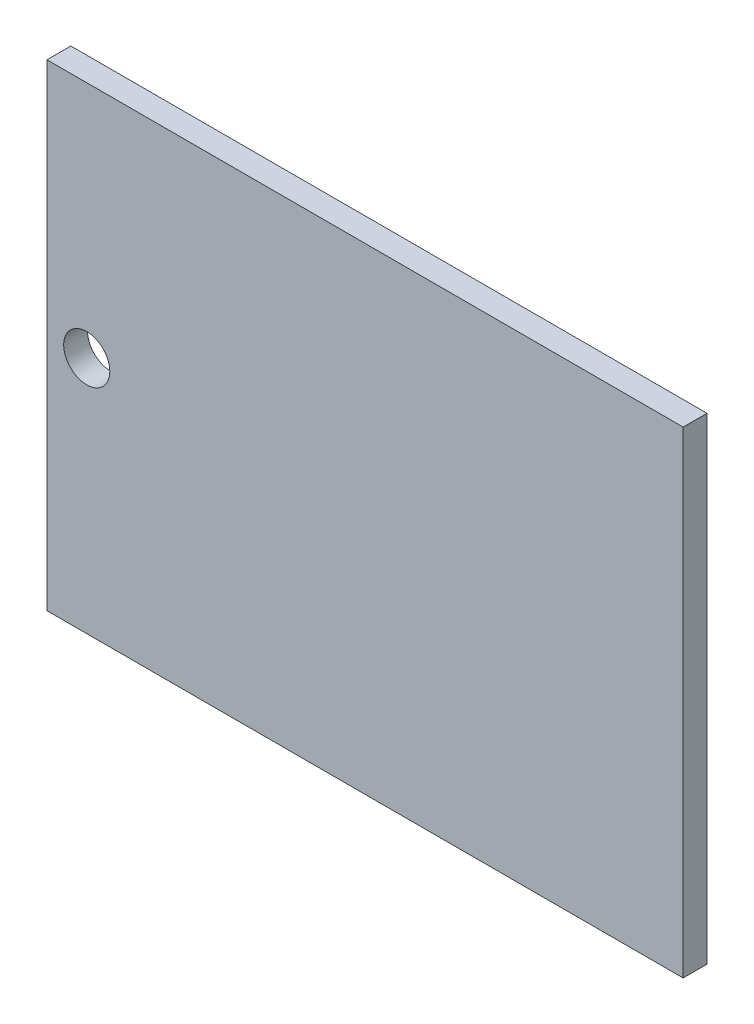
ISO-10303-21;
HEADER;
FILE_DESCRIPTION(('STEP AP214'),'2;1');
FILE_NAME('part.step','',(''),(''),'','','');
FILE_SCHEMA(('AUTOMOTIVE_DESIGN { 1 0 10303 214 1 1 1 1 }'));
ENDSEC;
DATA;
#1=APPLICATION_CONTEXT('core data for automotive mechanical design processes');
#2=APPLICATION_PROTOCOL_DEFINITION('international standard','automotive_design',2000,#1);
#3=PRODUCT_CONTEXT('',#1,'mechanical');
#4=PRODUCT('Part','Part','',(#3));
#5=PRODUCT_RELATED_PRODUCT_CATEGORY('part','',(#4));
#6=PRODUCT_DEFINITION_FORMATION('','',#4);
#7=PRODUCT_DEFINITION_CONTEXT('part definition',#1,'design');
#8=PRODUCT_DEFINITION('design','',#6,#7);
#9=PRODUCT_DEFINITION_SHAPE('','',#8);
#10=(LENGTH_UNIT() NAMED_UNIT(*) SI_UNIT(.MILLI.,.METRE.));
#11=(NAMED_UNIT(*) PLANE_ANGLE_UNIT() SI_UNIT($,.RADIAN.));
#12=(NAMED_UNIT(*) SI_UNIT($,.STERADIAN.) SOLID_ANGLE_UNIT());
#13=UNCERTAINTY_MEASURE_WITH_UNIT(LENGTH_MEASURE(1.E-05),#10,'distance_accuracy_value','');
#14=(GEOMETRIC_REPRESENTATION_CONTEXT(3) GLOBAL_UNCERTAINTY_ASSIGNED_CONTEXT((#13)) GLOBAL_UNIT_ASSIGNED_CONTEXT((#10,
#11,#12)) REPRESENTATION_CONTEXT('',''));
#15=CARTESIAN_POINT('',(0.,0.,0.));
#16=DIRECTION('',(0.,0.,1.));
#17=DIRECTION('',(1.,0.,0.));
#18=AXIS2_PLACEMENT_3D('',#15,#16,#17);
#19=CARTESIAN_POINT('',(20.,-15.,1.5));
#20=DIRECTION('',(-1.,0.,0.));
#21=DIRECTION('',(0.,0.,1.));
#22=AXIS2_PLACEMENT_3D('',#19,#20,#21);
#23=PLANE('',#22);
#24=DIRECTION('',(0.,1.,0.));
#25=VECTOR('',#24,1.);
#26=CARTESIAN_POINT('',(20.,-15.,0.));
#27=LINE('',#26,#25);
#28=CARTESIAN_POINT('',(20.,-15.,0.));
#29=VERTEX_POINT('',#28);
#30=CARTESIAN_POINT('',(20.,15.,0.));
#31=VERTEX_POINT('',#30);
#32=EDGE_CURVE('E105',#29,#31,#27,.T.);
#33=ORIENTED_EDGE('',*,*,#32,.T.);
#34=DIRECTION('',(0.,0.,-1.));
#35=VECTOR('',#34,1.);
#36=CARTESIAN_POINT('',(20.,15.,1.5));
#37=LINE('',#36,#35);
#38=CARTESIAN_POINT('',(20.,15.,1.5));
#39=VERTEX_POINT('',#38);
#40=EDGE_CURVE('E11',#39,#31,#37,.T.);
#41=ORIENTED_EDGE('',*,*,#40,.F.);
#42=DIRECTION('',(0.,1.,0.));
#43=VECTOR('',#42,1.);
#44=CARTESIAN_POINT('',(20.,-15.,1.5));
#45=LINE('',#44,#43);
#46=CARTESIAN_POINT('',(20.,-15.,1.5));
#47=VERTEX_POINT('',#46);
#48=EDGE_CURVE('E89',#47,#39,#45,.T.);
#49=ORIENTED_EDGE('',*,*,#48,.F.);
#50=DIRECTION('',(0.,0.,-1.));
#51=VECTOR('',#50,1.);
#52=CARTESIAN_POINT('',(20.,-15.,1.5));
#53=LINE('',#52,#51);
#54=EDGE_CURVE('E98',#47,#29,#53,.T.);
#55=ORIENTED_EDGE('',*,*,#54,.T.);
#56=EDGE_LOOP('',(#33,#41,#49,#55));
#57=FACE_BOUND('',#56,.T.);
#58=ADVANCED_FACE('F39',(#57),#23,.F.);
#59=CARTESIAN_POINT('',(-20.,15.,1.5));
#60=DIRECTION('',(0.,-1.,0.));
#61=DIRECTION('',(0.,0.,-1.));
#62=AXIS2_PLACEMENT_3D('',#59,#60,#61);
#63=PLANE('',#62);
#64=DIRECTION('',(-1.,0.,0.));
#65=VECTOR('',#64,1.);
#66=CARTESIAN_POINT('',(-20.,15.,0.));
#67=LINE('',#66,#65);
#68=CARTESIAN_POINT('',(-20.,15.,0.));
#69=VERTEX_POINT('',#68);
#70=EDGE_CURVE('E94',#31,#69,#67,.T.);
#71=ORIENTED_EDGE('',*,*,#70,.T.);
#72=DIRECTION('',(0.,0.,-1.));
#73=VECTOR('',#72,1.);
#74=CARTESIAN_POINT('',(-20.,15.,1.5));
#75=LINE('',#74,#73);
#76=CARTESIAN_POINT('',(-20.,15.,1.5));
#77=VERTEX_POINT('',#76);
#78=EDGE_CURVE('E50',#77,#69,#75,.T.);
#79=ORIENTED_EDGE('',*,*,#78,.F.);
#80=DIRECTION('',(-1.,0.,0.));
#81=VECTOR('',#80,1.);
#82=CARTESIAN_POINT('',(-20.,15.,1.5));
#83=LINE('',#82,#81);
#84=EDGE_CURVE('E84',#39,#77,#83,.T.);
#85=ORIENTED_EDGE('',*,*,#84,.F.);
#86=ORIENTED_EDGE('',*,*,#40,.T.);
#87=EDGE_LOOP('',(#71,#79,#85,#86));
#88=FACE_BOUND('',#87,.T.);
#89=ADVANCED_FACE('F91',(#88),#63,.F.);
#90=CARTESIAN_POINT('',(-20.,-15.,1.5));
#91=DIRECTION('',(1.,0.,0.));
#92=DIRECTION('',(0.,0.,-1.));
#93=AXIS2_PLACEMENT_3D('',#90,#91,#92);
#94=PLANE('',#93);
#95=DIRECTION('',(0.,-1.,0.));
#96=VECTOR('',#95,1.);
#97=CARTESIAN_POINT('',(-20.,-15.,0.));
#98=LINE('',#97,#96);
#99=CARTESIAN_POINT('',(-20.,-15.,0.));
#100=VERTEX_POINT('',#99);
#101=EDGE_CURVE('E75',#69,#100,#98,.T.);
#102=ORIENTED_EDGE('',*,*,#101,.T.);
#103=DIRECTION('',(0.,0.,-1.));
#104=VECTOR('',#103,1.);
#105=CARTESIAN_POINT('',(-20.,-15.,1.5));
#106=LINE('',#105,#104);
#107=CARTESIAN_POINT('',(-20.,-15.,1.5));
#108=VERTEX_POINT('',#107);
#109=EDGE_CURVE('E92',#108,#100,#106,.T.);
#110=ORIENTED_EDGE('',*,*,#109,.F.);
#111=DIRECTION('',(0.,-1.,0.));
#112=VECTOR('',#111,1.);
#113=CARTESIAN_POINT('',(-20.,-15.,1.5));
#114=LINE('',#113,#112);
#115=EDGE_CURVE('E86',#77,#108,#114,.T.);
#116=ORIENTED_EDGE('',*,*,#115,.F.);
#117=ORIENTED_EDGE('',*,*,#78,.T.);
#118=EDGE_LOOP('',(#102,#110,#116,#117));
#119=FACE_BOUND('',#118,.T.);
#120=ADVANCED_FACE('F96',(#119),#94,.F.);
#121=CARTESIAN_POINT('',(-20.,-15.,1.5));
#122=DIRECTION('',(0.,1.,0.));
#123=DIRECTION('',(0.,0.,1.));
#124=AXIS2_PLACEMENT_3D('',#121,#122,#123);
#125=PLANE('',#124);
#126=DIRECTION('',(1.,0.,0.));
#127=VECTOR('',#126,1.);
#128=CARTESIAN_POINT('',(-20.,-15.,0.));
#129=LINE('',#128,#127);
#130=EDGE_CURVE('E80',#100,#29,#129,.T.);
#131=ORIENTED_EDGE('',*,*,#130,.T.);
#132=ORIENTED_EDGE('',*,*,#54,.F.);
#133=DIRECTION('',(1.,0.,0.));
#134=VECTOR('',#133,1.);
#135=CARTESIAN_POINT('',(-20.,-15.,1.5));
#136=LINE('',#135,#134);
#137=EDGE_CURVE('E54',#108,#47,#136,.T.);
#138=ORIENTED_EDGE('',*,*,#137,.F.);
#139=ORIENTED_EDGE('',*,*,#109,.T.);
#140=EDGE_LOOP('',(#131,#132,#138,#139));
#141=FACE_BOUND('',#140,.T.);
#142=ADVANCED_FACE('F109',(#141),#125,.F.);
#143=CARTESIAN_POINT('',(0.,0.,1.5));
#144=DIRECTION('',(0.,0.,-1.));
#145=DIRECTION('',(-1.,0.,0.));
#146=AXIS2_PLACEMENT_3D('',#143,#144,#145);
#147=PLANE('',#146);
#148=CARTESIAN_POINT('',(-17.5,0.,1.5));
#149=DIRECTION('',(0.,0.,1.));
#150=DIRECTION('',(1.,0.,0.));
#151=AXIS2_PLACEMENT_3D('',#148,#149,#150);
#152=CIRCLE('',#151,1.45);
#153=CARTESIAN_POINT('',(-16.05,0.,1.5));
#154=VERTEX_POINT('',#153);
#155=EDGE_CURVE('E119',#154,#154,#152,.T.);
#156=ORIENTED_EDGE('',*,*,#155,.F.);
#157=EDGE_LOOP('',(#156));
#158=FACE_BOUND('',#157,.T.);
#159=ORIENTED_EDGE('',*,*,#48,.T.);
#160=ORIENTED_EDGE('',*,*,#84,.T.);
#161=ORIENTED_EDGE('',*,*,#115,.T.);
#162=ORIENTED_EDGE('',*,*,#137,.T.);
#163=EDGE_LOOP('',(#159,#160,#161,#162));
#164=FACE_BOUND('',#163,.T.);
#165=ADVANCED_FACE('F88',(#158,#164),#147,.F.);
#166=CARTESIAN_POINT('',(0.,0.,0.));
#167=DIRECTION('',(0.,0.,-1.));
#168=DIRECTION('',(-1.,0.,0.));
#169=AXIS2_PLACEMENT_3D('',#166,#167,#168);
#170=PLANE('',#169);
#171=CARTESIAN_POINT('',(-17.5,0.,0.));
#172=DIRECTION('',(0.,0.,1.));
#173=DIRECTION('',(1.,0.,0.));
#174=AXIS2_PLACEMENT_3D('',#171,#172,#173);
#175=CIRCLE('',#174,1.45);
#176=CARTESIAN_POINT('',(-16.05,0.,0.));
#177=VERTEX_POINT('',#176);
#178=EDGE_CURVE('E104',#177,#177,#175,.T.);
#179=ORIENTED_EDGE('',*,*,#178,.T.);
#180=EDGE_LOOP('',(#179));
#181=FACE_BOUND('',#180,.T.);
#182=ORIENTED_EDGE('',*,*,#32,.F.);
#183=ORIENTED_EDGE('',*,*,#130,.F.);
#184=ORIENTED_EDGE('',*,*,#101,.F.);
#185=ORIENTED_EDGE('',*,*,#70,.F.);
#186=EDGE_LOOP('',(#182,#183,#184,#185));
#187=FACE_BOUND('',#186,.T.);
#188=ADVANCED_FACE('F114',(#181,#187),#170,.T.);
#189=CARTESIAN_POINT('',(-17.5,0.,0.));
#190=DIRECTION('',(0.,0.,1.));
#191=DIRECTION('',(1.,0.,0.));
#192=AXIS2_PLACEMENT_3D('',#189,#190,#191);
#193=CYLINDRICAL_SURFACE('',#192,1.45);
#194=ORIENTED_EDGE('',*,*,#178,.F.);
#195=EDGE_LOOP('',(#194));
#196=FACE_BOUND('',#195,.T.);
#197=ORIENTED_EDGE('',*,*,#155,.T.);
#198=EDGE_LOOP('',(#197));
#199=FACE_BOUND('',#198,.T.);
#200=ADVANCED_FACE('F122',(#196,#199),#193,.F.);
#201=CLOSED_SHELL('',(#58,#89,#120,#142,#165,#188,#200));
#202=MANIFOLD_SOLID_BREP('B2',#201);
#203=ADVANCED_BREP_SHAPE_REPRESENTATION('',(#18,#202),#14);
#204=SHAPE_DEFINITION_REPRESENTATION(#9,#203);
ENDSEC;
END-ISO-10303-21;
